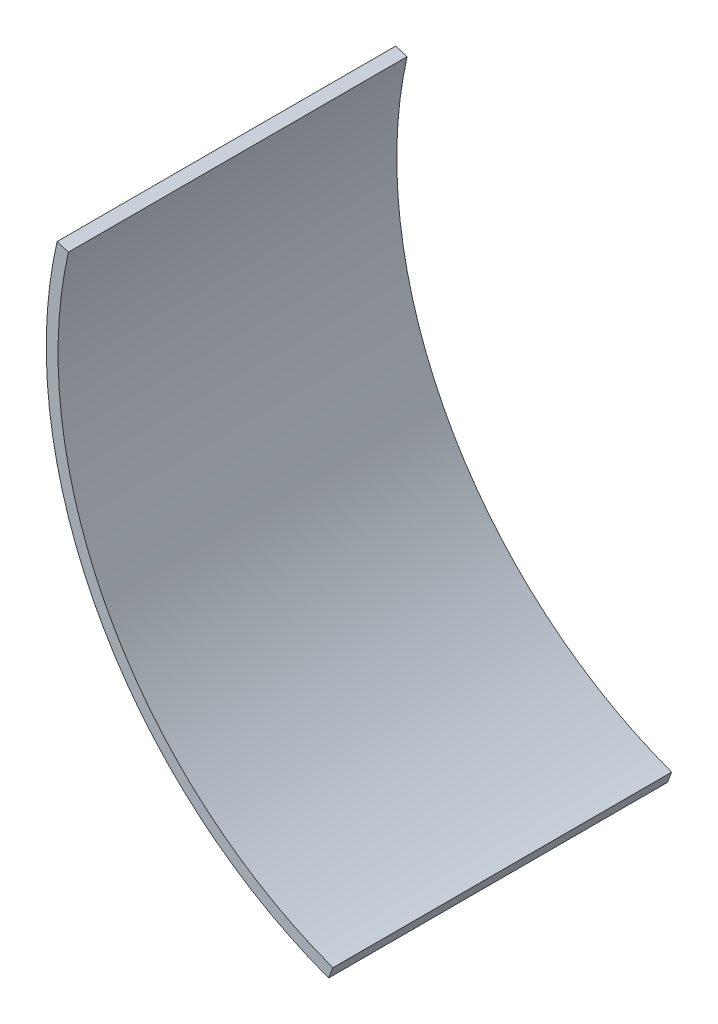
ISO-10303-21;
HEADER;
FILE_DESCRIPTION(('STEP AP214'),'2;1');
FILE_NAME('part.step','',(''),(''),'','','');
FILE_SCHEMA(('AUTOMOTIVE_DESIGN { 1 0 10303 214 1 1 1 1 }'));
ENDSEC;
DATA;
#1=APPLICATION_CONTEXT('core data for automotive mechanical design processes');
#2=APPLICATION_PROTOCOL_DEFINITION('international standard','automotive_design',2000,#1);
#3=PRODUCT_CONTEXT('',#1,'mechanical');
#4=PRODUCT('Part','Part','',(#3));
#5=PRODUCT_RELATED_PRODUCT_CATEGORY('part','',(#4));
#6=PRODUCT_DEFINITION_FORMATION('','',#4);
#7=PRODUCT_DEFINITION_CONTEXT('part definition',#1,'design');
#8=PRODUCT_DEFINITION('design','',#6,#7);
#9=PRODUCT_DEFINITION_SHAPE('','',#8);
#10=(LENGTH_UNIT() NAMED_UNIT(*) SI_UNIT(.MILLI.,.METRE.));
#11=(NAMED_UNIT(*) PLANE_ANGLE_UNIT() SI_UNIT($,.RADIAN.));
#12=(NAMED_UNIT(*) SI_UNIT($,.STERADIAN.) SOLID_ANGLE_UNIT());
#13=UNCERTAINTY_MEASURE_WITH_UNIT(LENGTH_MEASURE(1.E-05),#10,'distance_accuracy_value','');
#14=(GEOMETRIC_REPRESENTATION_CONTEXT(3) GLOBAL_UNCERTAINTY_ASSIGNED_CONTEXT((#13)) GLOBAL_UNIT_ASSIGNED_CONTEXT((#10,
#11,#12)) REPRESENTATION_CONTEXT('',''));
#15=CARTESIAN_POINT('',(0.,0.,0.));
#16=DIRECTION('',(0.,0.,1.));
#17=DIRECTION('',(1.,0.,0.));
#18=AXIS2_PLACEMENT_3D('',#15,#16,#17);
#19=CARTESIAN_POINT('',(3243.45082456271,1808.28370384598,430.));
#20=DIRECTION('',(0.,0.,-1.));
#21=DIRECTION('',(-1.,0.,0.));
#22=AXIS2_PLACEMENT_3D('',#19,#20,#21);
#23=CYLINDRICAL_SURFACE('',#22,534.387659983748);
#24=CARTESIAN_POINT('',(3243.45082456271,1808.28370384598,0.));
#25=DIRECTION('',(0.,0.,1.));
#26=DIRECTION('',(1.,0.,0.));
#27=AXIS2_PLACEMENT_3D('',#24,#25,#26);
#28=CIRCLE('',#27,534.387659983748);
#29=CARTESIAN_POINT('',(2722.16389424815,1925.88518098862,0.));
#30=VERTEX_POINT('',#29);
#31=CARTESIAN_POINT('',(3057.99719968873,1307.10796205074,0.));
#32=VERTEX_POINT('',#31);
#33=EDGE_CURVE('E97',#30,#32,#28,.T.);
#34=ORIENTED_EDGE('',*,*,#33,.F.);
#35=DIRECTION('',(0.,0.,-1.));
#36=VECTOR('',#35,1.);
#37=CARTESIAN_POINT('',(2722.16389424815,1925.88518098862,430.));
#38=LINE('',#37,#36);
#39=CARTESIAN_POINT('',(2722.16389424815,1925.88518098862,430.));
#40=VERTEX_POINT('',#39);
#41=EDGE_CURVE('E11',#40,#30,#38,.T.);
#42=ORIENTED_EDGE('',*,*,#41,.F.);
#43=CARTESIAN_POINT('',(3243.45082456271,1808.28370384598,430.));
#44=DIRECTION('',(0.,0.,1.));
#45=DIRECTION('',(1.,0.,0.));
#46=AXIS2_PLACEMENT_3D('',#43,#44,#45);
#47=CIRCLE('',#46,534.387659983748);
#48=CARTESIAN_POINT('',(3057.99719968873,1307.10796205074,430.));
#49=VERTEX_POINT('',#48);
#50=EDGE_CURVE('E91',#40,#49,#47,.T.);
#51=ORIENTED_EDGE('',*,*,#50,.T.);
#52=DIRECTION('',(0.,0.,-1.));
#53=VECTOR('',#52,1.);
#54=CARTESIAN_POINT('',(3057.99719968873,1307.10796205074,430.));
#55=LINE('',#54,#53);
#56=EDGE_CURVE('E72',#49,#32,#55,.T.);
#57=ORIENTED_EDGE('',*,*,#56,.T.);
#58=EDGE_LOOP('',(#34,#42,#51,#57));
#59=FACE_BOUND('',#58,.T.);
#60=ADVANCED_FACE('F34',(#59),#23,.F.);
#61=CARTESIAN_POINT('',(798.951636533948,2532.59605966858,430.));
#62=DIRECTION('',(0.300852104091896,0.953670808750839,0.));
#63=DIRECTION('',(-0.953670808750839,0.300852104091896,0.));
#64=AXIS2_PLACEMENT_3D('',#61,#62,#63);
#65=PLANE('',#64);
#66=DIRECTION('',(0.953670808750839,-0.300852104091896,0.));
#67=VECTOR('',#66,1.);
#68=CARTESIAN_POINT('',(798.951636533948,2532.59605966858,0.));
#69=LINE('',#68,#67);
#70=CARTESIAN_POINT('',(2707.80995361861,1930.41338212552,0.));
#71=VERTEX_POINT('',#70);
#72=EDGE_CURVE('E85',#71,#30,#69,.T.);
#73=ORIENTED_EDGE('',*,*,#72,.F.);
#74=DIRECTION('',(0.,0.,-1.));
#75=VECTOR('',#74,1.);
#76=CARTESIAN_POINT('',(2707.80995361861,1930.41338212552,430.));
#77=LINE('',#76,#75);
#78=CARTESIAN_POINT('',(2707.80995361861,1930.41338212552,430.));
#79=VERTEX_POINT('',#78);
#80=EDGE_CURVE('E42',#79,#71,#77,.T.);
#81=ORIENTED_EDGE('',*,*,#80,.F.);
#82=DIRECTION('',(0.953670808750839,-0.300852104091896,0.));
#83=VECTOR('',#82,1.);
#84=CARTESIAN_POINT('',(798.951636533948,2532.59605966858,430.));
#85=LINE('',#84,#83);
#86=EDGE_CURVE('E83',#79,#40,#85,.T.);
#87=ORIENTED_EDGE('',*,*,#86,.T.);
#88=ORIENTED_EDGE('',*,*,#41,.T.);
#89=EDGE_LOOP('',(#73,#81,#87,#88));
#90=FACE_BOUND('',#89,.T.);
#91=ADVANCED_FACE('F81',(#90),#65,.T.);
#92=CARTESIAN_POINT('',(3243.45082456271,1808.28370384598,430.));
#93=DIRECTION('',(0.,0.,-1.));
#94=DIRECTION('',(-1.,0.,0.));
#95=AXIS2_PLACEMENT_3D('',#92,#93,#94);
#96=CYLINDRICAL_SURFACE('',#95,549.387659983748);
#97=CARTESIAN_POINT('',(3243.45082456271,1808.28370384598,0.));
#98=DIRECTION('',(0.,0.,1.));
#99=DIRECTION('',(1.,0.,0.));
#100=AXIS2_PLACEMENT_3D('',#97,#98,#99);
#101=CIRCLE('',#100,549.387659983748);
#102=CARTESIAN_POINT('',(3052.55928390283,1293.12623214736,0.));
#103=VERTEX_POINT('',#102);
#104=EDGE_CURVE('E65',#71,#103,#101,.T.);
#105=ORIENTED_EDGE('',*,*,#104,.T.);
#106=DIRECTION('',(0.,0.,-1.));
#107=VECTOR('',#106,1.);
#108=CARTESIAN_POINT('',(3052.55928390283,1293.12623214736,430.));
#109=LINE('',#108,#107);
#110=CARTESIAN_POINT('',(3052.55928390283,1293.12623214736,430.));
#111=VERTEX_POINT('',#110);
#112=EDGE_CURVE('E86',#111,#103,#109,.T.);
#113=ORIENTED_EDGE('',*,*,#112,.F.);
#114=CARTESIAN_POINT('',(3243.45082456271,1808.28370384598,430.));
#115=DIRECTION('',(0.,0.,1.));
#116=DIRECTION('',(1.,0.,0.));
#117=AXIS2_PLACEMENT_3D('',#114,#115,#116);
#118=CIRCLE('',#117,549.387659983748);
#119=EDGE_CURVE('E87',#79,#111,#118,.T.);
#120=ORIENTED_EDGE('',*,*,#119,.F.);
#121=ORIENTED_EDGE('',*,*,#80,.T.);
#122=EDGE_LOOP('',(#105,#113,#120,#121));
#123=FACE_BOUND('',#122,.T.);
#124=ADVANCED_FACE('F88',(#123),#96,.T.);
#125=CARTESIAN_POINT('',(2214.62472795747,-861.334244847671,430.));
#126=DIRECTION('',(-0.931991692548014,0.362479633940293,0.));
#127=DIRECTION('',(-0.362479633940293,-0.931991692548014,0.));
#128=AXIS2_PLACEMENT_3D('',#125,#126,#127);
#129=PLANE('',#128);
#130=DIRECTION('',(0.362479633940293,0.931991692548014,0.));
#131=VECTOR('',#130,1.);
#132=CARTESIAN_POINT('',(2214.62472795747,-861.334244847671,0.));
#133=LINE('',#132,#131);
#134=EDGE_CURVE('E93',#103,#32,#133,.T.);
#135=ORIENTED_EDGE('',*,*,#134,.T.);
#136=ORIENTED_EDGE('',*,*,#56,.F.);
#137=DIRECTION('',(0.362479633940293,0.931991692548014,0.));
#138=VECTOR('',#137,1.);
#139=CARTESIAN_POINT('',(2214.62472795747,-861.334244847671,430.));
#140=LINE('',#139,#138);
#141=EDGE_CURVE('E50',#111,#49,#140,.T.);
#142=ORIENTED_EDGE('',*,*,#141,.F.);
#143=ORIENTED_EDGE('',*,*,#112,.T.);
#144=EDGE_LOOP('',(#135,#136,#142,#143));
#145=FACE_BOUND('',#144,.T.);
#146=ADVANCED_FACE('F106',(#145),#129,.F.);
#147=CARTESIAN_POINT('',(0.,0.,430.));
#148=DIRECTION('',(0.,0.,1.));
#149=DIRECTION('',(1.,0.,0.));
#150=AXIS2_PLACEMENT_3D('',#147,#148,#149);
#151=PLANE('',#150);
#152=ORIENTED_EDGE('',*,*,#50,.F.);
#153=ORIENTED_EDGE('',*,*,#86,.F.);
#154=ORIENTED_EDGE('',*,*,#119,.T.);
#155=ORIENTED_EDGE('',*,*,#141,.T.);
#156=EDGE_LOOP('',(#152,#153,#154,#155));
#157=FACE_BOUND('',#156,.T.);
#158=ADVANCED_FACE('F90',(#157),#151,.T.);
#159=CARTESIAN_POINT('',(0.,0.,0.));
#160=DIRECTION('',(0.,0.,1.));
#161=DIRECTION('',(1.,0.,0.));
#162=AXIS2_PLACEMENT_3D('',#159,#160,#161);
#163=PLANE('',#162);
#164=ORIENTED_EDGE('',*,*,#33,.T.);
#165=ORIENTED_EDGE('',*,*,#134,.F.);
#166=ORIENTED_EDGE('',*,*,#104,.F.);
#167=ORIENTED_EDGE('',*,*,#72,.T.);
#168=EDGE_LOOP('',(#164,#165,#166,#167));
#169=FACE_BOUND('',#168,.T.);
#170=ADVANCED_FACE('F108',(#169),#163,.F.);
#171=CLOSED_SHELL('',(#60,#91,#124,#146,#158,#170));
#172=MANIFOLD_SOLID_BREP('B2',#171);
#173=ADVANCED_BREP_SHAPE_REPRESENTATION('',(#18,#172),#14);
#174=SHAPE_DEFINITION_REPRESENTATION(#9,#173);
ENDSEC;
END-ISO-10303-21;
